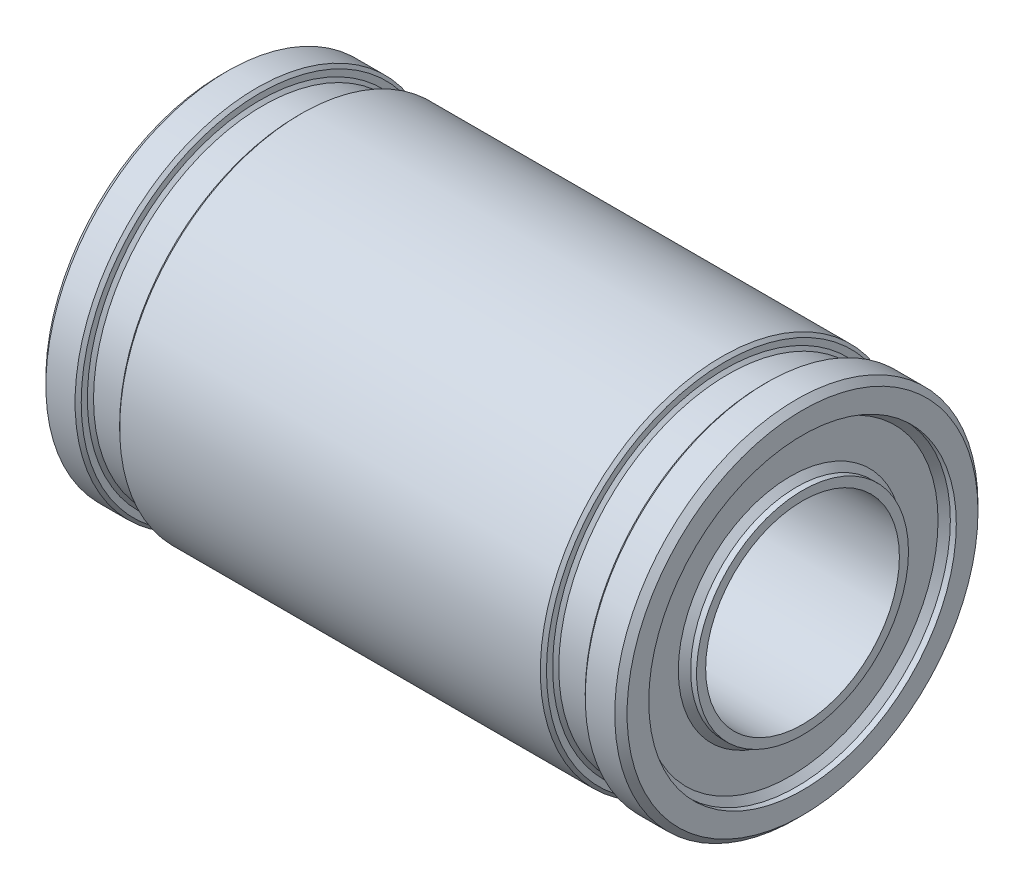
ISO-10303-21;
HEADER;
FILE_DESCRIPTION(('STEP AP214'),'2;1');
FILE_NAME('part.step','',(''),(''),'','','');
FILE_SCHEMA(('AUTOMOTIVE_DESIGN { 1 0 10303 214 1 1 1 1 }'));
ENDSEC;
DATA;
#1=APPLICATION_CONTEXT('core data for automotive mechanical design processes');
#2=APPLICATION_PROTOCOL_DEFINITION('international standard','automotive_design',2000,#1);
#3=PRODUCT_CONTEXT('',#1,'mechanical');
#4=PRODUCT('Part','Part','',(#3));
#5=PRODUCT_RELATED_PRODUCT_CATEGORY('part','',(#4));
#6=PRODUCT_DEFINITION_FORMATION('','',#4);
#7=PRODUCT_DEFINITION_CONTEXT('part definition',#1,'design');
#8=PRODUCT_DEFINITION('design','',#6,#7);
#9=PRODUCT_DEFINITION_SHAPE('','',#8);
#10=(LENGTH_UNIT() NAMED_UNIT(*) SI_UNIT(.MILLI.,.METRE.));
#11=(NAMED_UNIT(*) PLANE_ANGLE_UNIT() SI_UNIT($,.RADIAN.));
#12=(NAMED_UNIT(*) SI_UNIT($,.STERADIAN.) SOLID_ANGLE_UNIT());
#13=UNCERTAINTY_MEASURE_WITH_UNIT(LENGTH_MEASURE(1.E-05),#10,'distance_accuracy_value','');
#14=(GEOMETRIC_REPRESENTATION_CONTEXT(3) GLOBAL_UNCERTAINTY_ASSIGNED_CONTEXT((#13)) GLOBAL_UNIT_ASSIGNED_CONTEXT((#10,
#11,#12)) REPRESENTATION_CONTEXT('',''));
#15=CARTESIAN_POINT('',(0.,0.,0.));
#16=DIRECTION('',(0.,0.,1.));
#17=DIRECTION('',(1.,0.,0.));
#18=AXIS2_PLACEMENT_3D('',#15,#16,#17);
#19=CARTESIAN_POINT('',(-1.70147576583624E-09,0.,0.));
#20=DIRECTION('',(1.,0.,0.));
#21=DIRECTION('',(0.,0.,-1.));
#22=AXIS2_PLACEMENT_3D('',#19,#20,#21);
#23=CYLINDRICAL_SURFACE('',#22,6.35);
#24=CARTESIAN_POINT('',(24.,0.,0.));
#25=DIRECTION('',(1.,0.,0.));
#26=DIRECTION('',(0.,0.,-1.));
#27=AXIS2_PLACEMENT_3D('',#24,#25,#26);
#28=CIRCLE('',#27,6.35);
#29=CARTESIAN_POINT('',(24.,0.,-6.35));
#30=VERTEX_POINT('',#29);
#31=EDGE_CURVE('E10',#30,#30,#28,.T.);
#32=ORIENTED_EDGE('',*,*,#31,.T.);
#33=EDGE_LOOP('',(#32));
#34=FACE_BOUND('',#33,.T.);
#35=CARTESIAN_POINT('',(23.754,0.,0.));
#36=DIRECTION('',(1.,0.,0.));
#37=DIRECTION('',(0.,0.,-1.));
#38=AXIS2_PLACEMENT_3D('',#35,#36,#37);
#39=CIRCLE('',#38,6.35);
#40=CARTESIAN_POINT('',(23.754,0.,-6.35));
#41=VERTEX_POINT('',#40);
#42=EDGE_CURVE('E139',#41,#41,#39,.T.);
#43=ORIENTED_EDGE('',*,*,#42,.F.);
#44=EDGE_LOOP('',(#43));
#45=FACE_BOUND('',#44,.T.);
#46=ADVANCED_FACE('F33',(#34,#45),#23,.F.);
#47=CARTESIAN_POINT('',(24.,6.35,0.));
#48=DIRECTION('',(1.,0.,0.));
#49=DIRECTION('',(0.,0.,-1.));
#50=AXIS2_PLACEMENT_3D('',#47,#48,#49);
#51=PLANE('',#50);
#52=CARTESIAN_POINT('',(24.,0.,0.));
#53=DIRECTION('',(1.,0.,0.));
#54=DIRECTION('',(0.,0.,-1.));
#55=AXIS2_PLACEMENT_3D('',#52,#53,#54);
#56=CIRCLE('',#55,7.24599999914927);
#57=CARTESIAN_POINT('',(24.,0.,-7.24599999914927));
#58=VERTEX_POINT('',#57);
#59=EDGE_CURVE('E39',#58,#58,#56,.T.);
#60=ORIENTED_EDGE('',*,*,#59,.T.);
#61=EDGE_LOOP('',(#60));
#62=FACE_BOUND('',#61,.T.);
#63=ORIENTED_EDGE('',*,*,#31,.F.);
#64=EDGE_LOOP('',(#63));
#65=FACE_BOUND('',#64,.T.);
#66=ADVANCED_FACE('F147',(#62,#65),#51,.T.);
#67=CARTESIAN_POINT('',(24.,0.,0.));
#68=DIRECTION('',(-1.,0.,0.));
#69=DIRECTION('',(0.,0.,1.));
#70=AXIS2_PLACEMENT_3D('',#67,#68,#69);
#71=CONICAL_SURFACE('',#70,7.24599999914927,0.785398163397448);
#72=CARTESIAN_POINT('',(23.746,0.,0.));
#73=DIRECTION('',(1.,0.,0.));
#74=DIRECTION('',(0.,0.,-1.));
#75=AXIS2_PLACEMENT_3D('',#72,#73,#74);
#76=CIRCLE('',#75,7.49999999914926);
#77=CARTESIAN_POINT('',(23.746,0.,-7.49999999914926));
#78=VERTEX_POINT('',#77);
#79=EDGE_CURVE('E43',#78,#78,#76,.T.);
#80=ORIENTED_EDGE('',*,*,#79,.T.);
#81=EDGE_LOOP('',(#80));
#82=FACE_BOUND('',#81,.T.);
#83=ORIENTED_EDGE('',*,*,#59,.F.);
#84=EDGE_LOOP('',(#83));
#85=FACE_BOUND('',#84,.T.);
#86=ADVANCED_FACE('F151',(#82,#85),#71,.T.);
#87=CARTESIAN_POINT('',(-1.70147576583624E-09,0.,0.));
#88=DIRECTION('',(1.,0.,0.));
#89=DIRECTION('',(0.,0.,-1.));
#90=AXIS2_PLACEMENT_3D('',#87,#88,#89);
#91=CYLINDRICAL_SURFACE('',#90,7.49999999914926);
#92=CARTESIAN_POINT('',(22.5268000008508,0.,0.));
#93=DIRECTION('',(1.,0.,0.));
#94=DIRECTION('',(0.,0.,-1.));
#95=AXIS2_PLACEMENT_3D('',#92,#93,#94);
#96=CIRCLE('',#95,7.49999999914926);
#97=CARTESIAN_POINT('',(22.5268000008508,0.,-7.49999999914926));
#98=VERTEX_POINT('',#97);
#99=EDGE_CURVE('E47',#98,#98,#96,.T.);
#100=ORIENTED_EDGE('',*,*,#99,.T.);
#101=EDGE_LOOP('',(#100));
#102=FACE_BOUND('',#101,.T.);
#103=ORIENTED_EDGE('',*,*,#79,.F.);
#104=EDGE_LOOP('',(#103));
#105=FACE_BOUND('',#104,.T.);
#106=ADVANCED_FACE('F155',(#102,#105),#91,.T.);
#107=CARTESIAN_POINT('',(22.5268000008508,0.,0.));
#108=DIRECTION('',(1.,0.,0.));
#109=DIRECTION('',(0.,0.,-1.));
#110=AXIS2_PLACEMENT_3D('',#107,#108,#109);
#111=CONICAL_SURFACE('',#110,7.49999999914926,0.785398153349373);
#112=CARTESIAN_POINT('',(22.3998000017015,0.,0.));
#113=DIRECTION('',(1.,0.,0.));
#114=DIRECTION('',(0.,0.,-1.));
#115=AXIS2_PLACEMENT_3D('',#112,#113,#114);
#116=CIRCLE('',#115,7.37300000255221);
#117=CARTESIAN_POINT('',(22.3998000017015,0.,-7.37300000255221));
#118=VERTEX_POINT('',#117);
#119=EDGE_CURVE('E52',#118,#118,#116,.T.);
#120=ORIENTED_EDGE('',*,*,#119,.T.);
#121=EDGE_LOOP('',(#120));
#122=FACE_BOUND('',#121,.T.);
#123=ORIENTED_EDGE('',*,*,#99,.F.);
#124=EDGE_LOOP('',(#123));
#125=FACE_BOUND('',#124,.T.);
#126=ADVANCED_FACE('F162',(#122,#125),#111,.T.);
#127=CARTESIAN_POINT('',(22.3998000017015,7.37300000255221,0.));
#128=DIRECTION('',(-1.,0.,0.));
#129=DIRECTION('',(0.,0.,1.));
#130=AXIS2_PLACEMENT_3D('',#127,#128,#129);
#131=PLANE('',#130);
#132=CARTESIAN_POINT('',(22.3998000017015,0.,0.));
#133=DIRECTION('',(1.,0.,0.));
#134=DIRECTION('',(0.,0.,-1.));
#135=AXIS2_PLACEMENT_3D('',#132,#133,#134);
#136=CIRCLE('',#135,7.11900000085074);
#137=CARTESIAN_POINT('',(22.3998000017015,0.,-7.11900000085074));
#138=VERTEX_POINT('',#137);
#139=EDGE_CURVE('E55',#138,#138,#136,.T.);
#140=ORIENTED_EDGE('',*,*,#139,.T.);
#141=EDGE_LOOP('',(#140));
#142=FACE_BOUND('',#141,.T.);
#143=ORIENTED_EDGE('',*,*,#119,.F.);
#144=EDGE_LOOP('',(#143));
#145=FACE_BOUND('',#144,.T.);
#146=ADVANCED_FACE('F166',(#142,#145),#131,.T.);
#147=CARTESIAN_POINT('',(22.3998000017015,0.,0.));
#148=DIRECTION('',(1.,0.,0.));
#149=DIRECTION('',(0.,0.,-1.));
#150=AXIS2_PLACEMENT_3D('',#147,#148,#149);
#151=CONICAL_SURFACE('',#150,7.11900000085074,0.785398163397445);
#152=CARTESIAN_POINT('',(22.2728000017015,0.,0.));
#153=DIRECTION('',(1.,0.,0.));
#154=DIRECTION('',(0.,0.,-1.));
#155=AXIS2_PLACEMENT_3D('',#152,#153,#154);
#156=CIRCLE('',#155,6.99200000085074);
#157=CARTESIAN_POINT('',(22.2728000017015,0.,-6.99200000085074));
#158=VERTEX_POINT('',#157);
#159=EDGE_CURVE('E58',#158,#158,#156,.T.);
#160=ORIENTED_EDGE('',*,*,#159,.T.);
#161=EDGE_LOOP('',(#160));
#162=FACE_BOUND('',#161,.T.);
#163=ORIENTED_EDGE('',*,*,#139,.F.);
#164=EDGE_LOOP('',(#163));
#165=FACE_BOUND('',#164,.T.);
#166=ADVANCED_FACE('F170',(#162,#165),#151,.T.);
#167=CARTESIAN_POINT('',(-1.70147576583624E-09,0.,0.));
#168=DIRECTION('',(1.,0.,0.));
#169=DIRECTION('',(0.,0.,-1.));
#170=AXIS2_PLACEMENT_3D('',#167,#168,#169);
#171=CYLINDRICAL_SURFACE('',#170,6.99200000085074);
#172=CARTESIAN_POINT('',(20.9266000025522,0.,0.));
#173=DIRECTION('',(1.,0.,0.));
#174=DIRECTION('',(0.,0.,-1.));
#175=AXIS2_PLACEMENT_3D('',#172,#173,#174);
#176=CIRCLE('',#175,6.99200000085074);
#177=CARTESIAN_POINT('',(20.9266000025522,0.,-6.99200000085074));
#178=VERTEX_POINT('',#177);
#179=EDGE_CURVE('E61',#178,#178,#176,.T.);
#180=ORIENTED_EDGE('',*,*,#179,.T.);
#181=EDGE_LOOP('',(#180));
#182=FACE_BOUND('',#181,.T.);
#183=ORIENTED_EDGE('',*,*,#159,.F.);
#184=EDGE_LOOP('',(#183));
#185=FACE_BOUND('',#184,.T.);
#186=ADVANCED_FACE('F174',(#182,#185),#171,.T.);
#187=CARTESIAN_POINT('',(20.9266000025522,0.,0.));
#188=DIRECTION('',(-1.,0.,0.));
#189=DIRECTION('',(0.,0.,1.));
#190=AXIS2_PLACEMENT_3D('',#187,#188,#189);
#191=CONICAL_SURFACE('',#190,6.99200000085074,0.785398139951919);
#192=CARTESIAN_POINT('',(20.7996,0.,0.));
#193=DIRECTION('',(1.,0.,0.));
#194=DIRECTION('',(0.,0.,-1.));
#195=AXIS2_PLACEMENT_3D('',#192,#193,#194);
#196=CIRCLE('',#195,7.11899999744779);
#197=CARTESIAN_POINT('',(20.7996,0.,-7.11899999744779));
#198=VERTEX_POINT('',#197);
#199=EDGE_CURVE('E64',#198,#198,#196,.T.);
#200=ORIENTED_EDGE('',*,*,#199,.T.);
#201=EDGE_LOOP('',(#200));
#202=FACE_BOUND('',#201,.T.);
#203=ORIENTED_EDGE('',*,*,#179,.F.);
#204=EDGE_LOOP('',(#203));
#205=FACE_BOUND('',#204,.T.);
#206=ADVANCED_FACE('F178',(#202,#205),#191,.T.);
#207=CARTESIAN_POINT('',(20.7996,7.11899999744779,0.));
#208=DIRECTION('',(1.,0.,0.));
#209=DIRECTION('',(0.,0.,-1.));
#210=AXIS2_PLACEMENT_3D('',#207,#208,#209);
#211=PLANE('',#210);
#212=CARTESIAN_POINT('',(20.7996,0.,0.));
#213=DIRECTION('',(1.,0.,0.));
#214=DIRECTION('',(0.,0.,-1.));
#215=AXIS2_PLACEMENT_3D('',#212,#213,#214);
#216=CIRCLE('',#215,7.37299999914926);
#217=CARTESIAN_POINT('',(20.7996,0.,-7.37299999914926));
#218=VERTEX_POINT('',#217);
#219=EDGE_CURVE('E67',#218,#218,#216,.T.);
#220=ORIENTED_EDGE('',*,*,#219,.T.);
#221=EDGE_LOOP('',(#220));
#222=FACE_BOUND('',#221,.T.);
#223=ORIENTED_EDGE('',*,*,#199,.F.);
#224=EDGE_LOOP('',(#223));
#225=FACE_BOUND('',#224,.T.);
#226=ADVANCED_FACE('F182',(#222,#225),#211,.T.);
#227=CARTESIAN_POINT('',(20.7996,0.,0.));
#228=DIRECTION('',(-1.,0.,0.));
#229=DIRECTION('',(0.,0.,1.));
#230=AXIS2_PLACEMENT_3D('',#227,#228,#229);
#231=CONICAL_SURFACE('',#230,7.37299999914926,0.785398163397445);
#232=CARTESIAN_POINT('',(20.6726,0.,0.));
#233=DIRECTION('',(1.,0.,0.));
#234=DIRECTION('',(0.,0.,-1.));
#235=AXIS2_PLACEMENT_3D('',#232,#233,#234);
#236=CIRCLE('',#235,7.49999999914926);
#237=CARTESIAN_POINT('',(20.6726,0.,-7.49999999914926));
#238=VERTEX_POINT('',#237);
#239=EDGE_CURVE('E70',#238,#238,#236,.T.);
#240=ORIENTED_EDGE('',*,*,#239,.T.);
#241=EDGE_LOOP('',(#240));
#242=FACE_BOUND('',#241,.T.);
#243=ORIENTED_EDGE('',*,*,#219,.F.);
#244=EDGE_LOOP('',(#243));
#245=FACE_BOUND('',#244,.T.);
#246=ADVANCED_FACE('F186',(#242,#245),#231,.T.);
#247=CARTESIAN_POINT('',(-1.70147576583624E-09,0.,0.));
#248=DIRECTION('',(1.,0.,0.));
#249=DIRECTION('',(0.,0.,-1.));
#250=AXIS2_PLACEMENT_3D('',#247,#248,#249);
#251=CYLINDRICAL_SURFACE('',#250,7.49999999914926);
#252=CARTESIAN_POINT('',(3.30200000085074,0.,0.));
#253=DIRECTION('',(1.,0.,0.));
#254=DIRECTION('',(0.,0.,-1.));
#255=AXIS2_PLACEMENT_3D('',#252,#253,#254);
#256=CIRCLE('',#255,7.49999999914926);
#257=CARTESIAN_POINT('',(3.30200000085074,0.,-7.49999999914926));
#258=VERTEX_POINT('',#257);
#259=EDGE_CURVE('E73',#258,#258,#256,.T.);
#260=ORIENTED_EDGE('',*,*,#259,.T.);
#261=EDGE_LOOP('',(#260));
#262=FACE_BOUND('',#261,.T.);
#263=ORIENTED_EDGE('',*,*,#239,.F.);
#264=EDGE_LOOP('',(#263));
#265=FACE_BOUND('',#264,.T.);
#266=ADVANCED_FACE('F190',(#262,#265),#251,.T.);
#267=CARTESIAN_POINT('',(3.30200000085074,0.,0.));
#268=DIRECTION('',(1.,0.,0.));
#269=DIRECTION('',(0.,0.,-1.));
#270=AXIS2_PLACEMENT_3D('',#267,#268,#269);
#271=CONICAL_SURFACE('',#270,7.49999999914926,0.785398153349359);
#272=CARTESIAN_POINT('',(3.17500000170148,0.,0.));
#273=DIRECTION('',(1.,0.,0.));
#274=DIRECTION('',(0.,0.,-1.));
#275=AXIS2_PLACEMENT_3D('',#272,#273,#274);
#276=CIRCLE('',#275,7.37300000255221);
#277=CARTESIAN_POINT('',(3.17500000170148,0.,-7.37300000255221));
#278=VERTEX_POINT('',#277);
#279=EDGE_CURVE('E76',#278,#278,#276,.T.);
#280=ORIENTED_EDGE('',*,*,#279,.T.);
#281=EDGE_LOOP('',(#280));
#282=FACE_BOUND('',#281,.T.);
#283=ORIENTED_EDGE('',*,*,#259,.F.);
#284=EDGE_LOOP('',(#283));
#285=FACE_BOUND('',#284,.T.);
#286=ADVANCED_FACE('F194',(#282,#285),#271,.T.);
#287=CARTESIAN_POINT('',(3.17500000170148,7.37300000255221,0.));
#288=DIRECTION('',(-1.,0.,0.));
#289=DIRECTION('',(0.,0.,1.));
#290=AXIS2_PLACEMENT_3D('',#287,#288,#289);
#291=PLANE('',#290);
#292=CARTESIAN_POINT('',(3.17500000170148,0.,0.));
#293=DIRECTION('',(1.,0.,0.));
#294=DIRECTION('',(0.,0.,-1.));
#295=AXIS2_PLACEMENT_3D('',#292,#293,#294);
#296=CIRCLE('',#295,7.11900000085074);
#297=CARTESIAN_POINT('',(3.17500000170148,0.,-7.11900000085074));
#298=VERTEX_POINT('',#297);
#299=EDGE_CURVE('E79',#298,#298,#296,.T.);
#300=ORIENTED_EDGE('',*,*,#299,.T.);
#301=EDGE_LOOP('',(#300));
#302=FACE_BOUND('',#301,.T.);
#303=ORIENTED_EDGE('',*,*,#279,.F.);
#304=EDGE_LOOP('',(#303));
#305=FACE_BOUND('',#304,.T.);
#306=ADVANCED_FACE('F198',(#302,#305),#291,.T.);
#307=CARTESIAN_POINT('',(3.17500000170148,0.,0.));
#308=DIRECTION('',(1.,0.,0.));
#309=DIRECTION('',(0.,0.,-1.));
#310=AXIS2_PLACEMENT_3D('',#307,#308,#309);
#311=CONICAL_SURFACE('',#310,7.11900000085074,0.785398163397448);
#312=CARTESIAN_POINT('',(3.04800000170148,0.,0.));
#313=DIRECTION('',(1.,0.,0.));
#314=DIRECTION('',(0.,0.,-1.));
#315=AXIS2_PLACEMENT_3D('',#312,#313,#314);
#316=CIRCLE('',#315,6.99200000085073);
#317=CARTESIAN_POINT('',(3.04800000170148,0.,-6.99200000085073));
#318=VERTEX_POINT('',#317);
#319=EDGE_CURVE('E82',#318,#318,#316,.T.);
#320=ORIENTED_EDGE('',*,*,#319,.T.);
#321=EDGE_LOOP('',(#320));
#322=FACE_BOUND('',#321,.T.);
#323=ORIENTED_EDGE('',*,*,#299,.F.);
#324=EDGE_LOOP('',(#323));
#325=FACE_BOUND('',#324,.T.);
#326=ADVANCED_FACE('F202',(#322,#325),#311,.T.);
#327=CARTESIAN_POINT('',(-1.70147576583624E-09,0.,0.));
#328=DIRECTION('',(1.,0.,0.));
#329=DIRECTION('',(0.,0.,-1.));
#330=AXIS2_PLACEMENT_3D('',#327,#328,#329);
#331=CYLINDRICAL_SURFACE('',#330,6.99200000085073);
#332=CARTESIAN_POINT('',(1.71450000255221,0.,0.));
#333=DIRECTION('',(1.,0.,0.));
#334=DIRECTION('',(0.,0.,-1.));
#335=AXIS2_PLACEMENT_3D('',#332,#333,#334);
#336=CIRCLE('',#335,6.99200000085073);
#337=CARTESIAN_POINT('',(1.71450000255221,0.,-6.99200000085073));
#338=VERTEX_POINT('',#337);
#339=EDGE_CURVE('E85',#338,#338,#336,.T.);
#340=ORIENTED_EDGE('',*,*,#339,.T.);
#341=EDGE_LOOP('',(#340));
#342=FACE_BOUND('',#341,.T.);
#343=ORIENTED_EDGE('',*,*,#319,.F.);
#344=EDGE_LOOP('',(#343));
#345=FACE_BOUND('',#344,.T.);
#346=ADVANCED_FACE('F206',(#342,#345),#331,.T.);
#347=CARTESIAN_POINT('',(1.71450000255221,0.,0.));
#348=DIRECTION('',(-1.,0.,0.));
#349=DIRECTION('',(0.,0.,1.));
#350=AXIS2_PLACEMENT_3D('',#347,#348,#349);
#351=CONICAL_SURFACE('',#350,6.99200000085073,0.785398150000001);
#352=CARTESIAN_POINT('',(1.58750000085074,0.,0.));
#353=DIRECTION('',(1.,0.,0.));
#354=DIRECTION('',(0.,0.,-1.));
#355=AXIS2_PLACEMENT_3D('',#352,#353,#354);
#356=CIRCLE('',#355,7.11899999914926);
#357=CARTESIAN_POINT('',(1.58750000085074,0.,-7.11899999914926));
#358=VERTEX_POINT('',#357);
#359=EDGE_CURVE('E88',#358,#358,#356,.T.);
#360=ORIENTED_EDGE('',*,*,#359,.T.);
#361=EDGE_LOOP('',(#360));
#362=FACE_BOUND('',#361,.T.);
#363=ORIENTED_EDGE('',*,*,#339,.F.);
#364=EDGE_LOOP('',(#363));
#365=FACE_BOUND('',#364,.T.);
#366=ADVANCED_FACE('F210',(#362,#365),#351,.T.);
#367=CARTESIAN_POINT('',(1.58750000085074,7.11899999914926,0.));
#368=DIRECTION('',(1.,0.,0.));
#369=DIRECTION('',(0.,0.,-1.));
#370=AXIS2_PLACEMENT_3D('',#367,#368,#369);
#371=PLANE('',#370);
#372=CARTESIAN_POINT('',(1.58750000085074,0.,0.));
#373=DIRECTION('',(1.,0.,0.));
#374=DIRECTION('',(0.,0.,-1.));
#375=AXIS2_PLACEMENT_3D('',#372,#373,#374);
#376=CIRCLE('',#375,7.37300000085073);
#377=CARTESIAN_POINT('',(1.58750000085074,0.,-7.37300000085073));
#378=VERTEX_POINT('',#377);
#379=EDGE_CURVE('E91',#378,#378,#376,.T.);
#380=ORIENTED_EDGE('',*,*,#379,.T.);
#381=EDGE_LOOP('',(#380));
#382=FACE_BOUND('',#381,.T.);
#383=ORIENTED_EDGE('',*,*,#359,.F.);
#384=EDGE_LOOP('',(#383));
#385=FACE_BOUND('',#384,.T.);
#386=ADVANCED_FACE('F214',(#382,#385),#371,.T.);
#387=CARTESIAN_POINT('',(1.58750000085074,0.,0.));
#388=DIRECTION('',(-1.,0.,0.));
#389=DIRECTION('',(0.,0.,1.));
#390=AXIS2_PLACEMENT_3D('',#387,#388,#389);
#391=CONICAL_SURFACE('',#390,7.37300000085073,0.785398150000005);
#392=CARTESIAN_POINT('',(1.46049999914926,0.,0.));
#393=DIRECTION('',(1.,0.,0.));
#394=DIRECTION('',(0.,0.,-1.));
#395=AXIS2_PLACEMENT_3D('',#392,#393,#394);
#396=CIRCLE('',#395,7.49999999914926);
#397=CARTESIAN_POINT('',(1.46049999914926,0.,-7.49999999914926));
#398=VERTEX_POINT('',#397);
#399=EDGE_CURVE('E94',#398,#398,#396,.T.);
#400=ORIENTED_EDGE('',*,*,#399,.T.);
#401=EDGE_LOOP('',(#400));
#402=FACE_BOUND('',#401,.T.);
#403=ORIENTED_EDGE('',*,*,#379,.F.);
#404=EDGE_LOOP('',(#403));
#405=FACE_BOUND('',#404,.T.);
#406=ADVANCED_FACE('F218',(#402,#405),#391,.T.);
#407=CARTESIAN_POINT('',(-1.70147576583624E-09,0.,0.));
#408=DIRECTION('',(1.,0.,0.));
#409=DIRECTION('',(0.,0.,-1.));
#410=AXIS2_PLACEMENT_3D('',#407,#408,#409);
#411=CYLINDRICAL_SURFACE('',#410,7.49999999914926);
#412=CARTESIAN_POINT('',(0.254000000000001,0.,0.));
#413=DIRECTION('',(1.,0.,0.));
#414=DIRECTION('',(0.,0.,-1.));
#415=AXIS2_PLACEMENT_3D('',#412,#413,#414);
#416=CIRCLE('',#415,7.49999999914926);
#417=CARTESIAN_POINT('',(0.254000000000001,0.,-7.49999999914926));
#418=VERTEX_POINT('',#417);
#419=EDGE_CURVE('E97',#418,#418,#416,.T.);
#420=ORIENTED_EDGE('',*,*,#419,.T.);
#421=EDGE_LOOP('',(#420));
#422=FACE_BOUND('',#421,.T.);
#423=ORIENTED_EDGE('',*,*,#399,.F.);
#424=EDGE_LOOP('',(#423));
#425=FACE_BOUND('',#424,.T.);
#426=ADVANCED_FACE('F222',(#422,#425),#411,.T.);
#427=CARTESIAN_POINT('',(0.254000000000001,0.,0.));
#428=DIRECTION('',(1.,0.,0.));
#429=DIRECTION('',(0.,0.,-1.));
#430=AXIS2_PLACEMENT_3D('',#427,#428,#429);
#431=CONICAL_SURFACE('',#430,7.49999999914926,0.785398163397448);
#432=CARTESIAN_POINT('',(0.,0.,0.));
#433=DIRECTION('',(1.,0.,0.));
#434=DIRECTION('',(0.,0.,-1.));
#435=AXIS2_PLACEMENT_3D('',#432,#433,#434);
#436=CIRCLE('',#435,7.24599999914926);
#437=CARTESIAN_POINT('',(0.,0.,-7.24599999914926));
#438=VERTEX_POINT('',#437);
#439=EDGE_CURVE('E100',#438,#438,#436,.T.);
#440=ORIENTED_EDGE('',*,*,#439,.T.);
#441=EDGE_LOOP('',(#440));
#442=FACE_BOUND('',#441,.T.);
#443=ORIENTED_EDGE('',*,*,#419,.F.);
#444=EDGE_LOOP('',(#443));
#445=FACE_BOUND('',#444,.T.);
#446=ADVANCED_FACE('F226',(#442,#445),#431,.T.);
#447=CARTESIAN_POINT('',(0.,7.24599999914926,0.));
#448=DIRECTION('',(-1.,0.,0.));
#449=DIRECTION('',(0.,0.,1.));
#450=AXIS2_PLACEMENT_3D('',#447,#448,#449);
#451=PLANE('',#450);
#452=CARTESIAN_POINT('',(0.,0.,0.));
#453=DIRECTION('',(1.,0.,0.));
#454=DIRECTION('',(0.,0.,-1.));
#455=AXIS2_PLACEMENT_3D('',#452,#453,#454);
#456=CIRCLE('',#455,6.35);
#457=CARTESIAN_POINT('',(0.,0.,-6.35));
#458=VERTEX_POINT('',#457);
#459=EDGE_CURVE('E103',#458,#458,#456,.T.);
#460=ORIENTED_EDGE('',*,*,#459,.T.);
#461=EDGE_LOOP('',(#460));
#462=FACE_BOUND('',#461,.T.);
#463=ORIENTED_EDGE('',*,*,#439,.F.);
#464=EDGE_LOOP('',(#463));
#465=FACE_BOUND('',#464,.T.);
#466=ADVANCED_FACE('F230',(#462,#465),#451,.T.);
#467=CARTESIAN_POINT('',(-1.70147576583624E-09,0.,0.));
#468=DIRECTION('',(1.,0.,0.));
#469=DIRECTION('',(0.,0.,-1.));
#470=AXIS2_PLACEMENT_3D('',#467,#468,#469);
#471=CYLINDRICAL_SURFACE('',#470,6.35);
#472=CARTESIAN_POINT('',(0.256329420676478,0.,0.));
#473=DIRECTION('',(1.,0.,0.));
#474=DIRECTION('',(0.,0.,-1.));
#475=AXIS2_PLACEMENT_3D('',#472,#473,#474);
#476=CIRCLE('',#475,6.35);
#477=CARTESIAN_POINT('',(0.256329420676478,0.,-6.35));
#478=VERTEX_POINT('',#477);
#479=EDGE_CURVE('E106',#478,#478,#476,.T.);
#480=ORIENTED_EDGE('',*,*,#479,.T.);
#481=EDGE_LOOP('',(#480));
#482=FACE_BOUND('',#481,.T.);
#483=ORIENTED_EDGE('',*,*,#459,.F.);
#484=EDGE_LOOP('',(#483));
#485=FACE_BOUND('',#484,.T.);
#486=ADVANCED_FACE('F234',(#482,#485),#471,.F.);
#487=CARTESIAN_POINT('',(0.256329420676478,0.,0.));
#488=DIRECTION('',(-1.,0.,0.));
#489=DIRECTION('',(0.,0.,1.));
#490=AXIS2_PLACEMENT_3D('',#487,#488,#489);
#491=CONICAL_SURFACE('',#490,6.35,0.785398163397448);
#492=CARTESIAN_POINT('',(0.510329420676478,0.,0.));
#493=DIRECTION('',(1.,0.,0.));
#494=DIRECTION('',(0.,0.,-1.));
#495=AXIS2_PLACEMENT_3D('',#492,#493,#494);
#496=CIRCLE('',#495,6.096);
#497=CARTESIAN_POINT('',(0.510329420676478,0.,-6.096));
#498=VERTEX_POINT('',#497);
#499=EDGE_CURVE('E109',#498,#498,#496,.T.);
#500=ORIENTED_EDGE('',*,*,#499,.T.);
#501=EDGE_LOOP('',(#500));
#502=FACE_BOUND('',#501,.T.);
#503=ORIENTED_EDGE('',*,*,#479,.F.);
#504=EDGE_LOOP('',(#503));
#505=FACE_BOUND('',#504,.T.);
#506=ADVANCED_FACE('F238',(#502,#505),#491,.F.);
#507=CARTESIAN_POINT('',(0.510329420676478,6.096,0.));
#508=DIRECTION('',(-1.,0.,0.));
#509=DIRECTION('',(0.,0.,1.));
#510=AXIS2_PLACEMENT_3D('',#507,#508,#509);
#511=PLANE('',#510);
#512=CARTESIAN_POINT('',(0.510329420676478,0.,0.));
#513=DIRECTION('',(1.,0.,0.));
#514=DIRECTION('',(0.,0.,-1.));
#515=AXIS2_PLACEMENT_3D('',#512,#513,#514);
#516=CIRCLE('',#515,4.62949932692042);
#517=CARTESIAN_POINT('',(0.510329420676478,0.,-4.62949932692042));
#518=VERTEX_POINT('',#517);
#519=EDGE_CURVE('E112',#518,#518,#516,.T.);
#520=ORIENTED_EDGE('',*,*,#519,.T.);
#521=EDGE_LOOP('',(#520));
#522=FACE_BOUND('',#521,.T.);
#523=ORIENTED_EDGE('',*,*,#499,.F.);
#524=EDGE_LOOP('',(#523));
#525=FACE_BOUND('',#524,.T.);
#526=ADVANCED_FACE('F242',(#522,#525),#511,.T.);
#527=CARTESIAN_POINT('',(0.510329420676478,0.,0.));
#528=DIRECTION('',(1.,0.,0.));
#529=DIRECTION('',(0.,0.,-1.));
#530=AXIS2_PLACEMENT_3D('',#527,#528,#529);
#531=CONICAL_SURFACE('',#530,4.62949932692042,0.78539815);
#532=CARTESIAN_POINT('',(0.256329417273526,0.,0.));
#533=DIRECTION('',(1.,0.,0.));
#534=DIRECTION('',(0.,0.,-1.));
#535=AXIS2_PLACEMENT_3D('',#532,#533,#534);
#536=CIRCLE('',#535,4.37549933032337);
#537=CARTESIAN_POINT('',(0.256329417273526,0.,-4.37549933032337));
#538=VERTEX_POINT('',#537);
#539=EDGE_CURVE('E115',#538,#538,#536,.T.);
#540=ORIENTED_EDGE('',*,*,#539,.T.);
#541=EDGE_LOOP('',(#540));
#542=FACE_BOUND('',#541,.T.);
#543=ORIENTED_EDGE('',*,*,#519,.F.);
#544=EDGE_LOOP('',(#543));
#545=FACE_BOUND('',#544,.T.);
#546=ADVANCED_FACE('F246',(#542,#545),#531,.T.);
#547=CARTESIAN_POINT('',(-1.70147576583624E-09,0.,0.));
#548=DIRECTION('',(1.,0.,0.));
#549=DIRECTION('',(0.,0.,-1.));
#550=AXIS2_PLACEMENT_3D('',#547,#548,#549);
#551=CYLINDRICAL_SURFACE('',#550,4.37549933032337);
#552=CARTESIAN_POINT('',(0.,0.,0.));
#553=DIRECTION('',(1.,0.,0.));
#554=DIRECTION('',(0.,0.,-1.));
#555=AXIS2_PLACEMENT_3D('',#552,#553,#554);
#556=CIRCLE('',#555,4.37549933032337);
#557=CARTESIAN_POINT('',(0.,0.,-4.37549933032337));
#558=VERTEX_POINT('',#557);
#559=EDGE_CURVE('E118',#558,#558,#556,.T.);
#560=ORIENTED_EDGE('',*,*,#559,.T.);
#561=EDGE_LOOP('',(#560));
#562=FACE_BOUND('',#561,.T.);
#563=ORIENTED_EDGE('',*,*,#539,.F.);
#564=EDGE_LOOP('',(#563));
#565=FACE_BOUND('',#564,.T.);
#566=ADVANCED_FACE('F250',(#562,#565),#551,.T.);
#567=CARTESIAN_POINT('',(0.,4.37549933032337,0.));
#568=DIRECTION('',(-1.,0.,0.));
#569=DIRECTION('',(0.,0.,1.));
#570=AXIS2_PLACEMENT_3D('',#567,#568,#569);
#571=PLANE('',#570);
#572=CARTESIAN_POINT('',(0.,0.,0.));
#573=DIRECTION('',(1.,0.,0.));
#574=DIRECTION('',(0.,0.,-1.));
#575=AXIS2_PLACEMENT_3D('',#572,#573,#574);
#576=CIRCLE('',#575,3.99999999744779);
#577=CARTESIAN_POINT('',(0.,0.,-3.99999999744779));
#578=VERTEX_POINT('',#577);
#579=EDGE_CURVE('E121',#578,#578,#576,.T.);
#580=ORIENTED_EDGE('',*,*,#579,.T.);
#581=EDGE_LOOP('',(#580));
#582=FACE_BOUND('',#581,.T.);
#583=ORIENTED_EDGE('',*,*,#559,.F.);
#584=EDGE_LOOP('',(#583));
#585=FACE_BOUND('',#584,.T.);
#586=ADVANCED_FACE('F254',(#582,#585),#571,.T.);
#587=CARTESIAN_POINT('',(-1.70147576583624E-09,0.,0.));
#588=DIRECTION('',(1.,0.,0.));
#589=DIRECTION('',(0.,0.,-1.));
#590=AXIS2_PLACEMENT_3D('',#587,#588,#589);
#591=CYLINDRICAL_SURFACE('',#590,3.99999999744779);
#592=CARTESIAN_POINT('',(24.,0.,0.));
#593=DIRECTION('',(1.,0.,0.));
#594=DIRECTION('',(0.,0.,-1.));
#595=AXIS2_PLACEMENT_3D('',#592,#593,#594);
#596=CIRCLE('',#595,3.99999999744779);
#597=CARTESIAN_POINT('',(24.,0.,-3.99999999744779));
#598=VERTEX_POINT('',#597);
#599=EDGE_CURVE('E124',#598,#598,#596,.T.);
#600=ORIENTED_EDGE('',*,*,#599,.T.);
#601=EDGE_LOOP('',(#600));
#602=FACE_BOUND('',#601,.T.);
#603=ORIENTED_EDGE('',*,*,#579,.F.);
#604=EDGE_LOOP('',(#603));
#605=FACE_BOUND('',#604,.T.);
#606=ADVANCED_FACE('F258',(#602,#605),#591,.F.);
#607=CARTESIAN_POINT('',(24.,3.99999999744779,0.));
#608=DIRECTION('',(1.,0.,0.));
#609=DIRECTION('',(0.,0.,-1.));
#610=AXIS2_PLACEMENT_3D('',#607,#608,#609);
#611=PLANE('',#610);
#612=CARTESIAN_POINT('',(24.,0.,0.));
#613=DIRECTION('',(1.,0.,0.));
#614=DIRECTION('',(0.,0.,-1.));
#615=AXIS2_PLACEMENT_3D('',#612,#613,#614);
#616=CIRCLE('',#615,4.37549933032337);
#617=CARTESIAN_POINT('',(24.,0.,-4.37549933032337));
#618=VERTEX_POINT('',#617);
#619=EDGE_CURVE('E127',#618,#618,#616,.T.);
#620=ORIENTED_EDGE('',*,*,#619,.T.);
#621=EDGE_LOOP('',(#620));
#622=FACE_BOUND('',#621,.T.);
#623=ORIENTED_EDGE('',*,*,#599,.F.);
#624=EDGE_LOOP('',(#623));
#625=FACE_BOUND('',#624,.T.);
#626=ADVANCED_FACE('F262',(#622,#625),#611,.T.);
#627=CARTESIAN_POINT('',(-1.70147576583624E-09,0.,0.));
#628=DIRECTION('',(1.,0.,0.));
#629=DIRECTION('',(0.,0.,-1.));
#630=AXIS2_PLACEMENT_3D('',#627,#628,#629);
#631=CYLINDRICAL_SURFACE('',#630,4.37549933032337);
#632=CARTESIAN_POINT('',(23.7539999982985,0.,0.));
#633=DIRECTION('',(1.,0.,0.));
#634=DIRECTION('',(0.,0.,-1.));
#635=AXIS2_PLACEMENT_3D('',#632,#633,#634);
#636=CIRCLE('',#635,4.37549933032337);
#637=CARTESIAN_POINT('',(23.7539999982985,0.,-4.37549933032337));
#638=VERTEX_POINT('',#637);
#639=EDGE_CURVE('E130',#638,#638,#636,.T.);
#640=ORIENTED_EDGE('',*,*,#639,.T.);
#641=EDGE_LOOP('',(#640));
#642=FACE_BOUND('',#641,.T.);
#643=ORIENTED_EDGE('',*,*,#619,.F.);
#644=EDGE_LOOP('',(#643));
#645=FACE_BOUND('',#644,.T.);
#646=ADVANCED_FACE('F266',(#642,#645),#631,.T.);
#647=CARTESIAN_POINT('',(23.7539999982985,0.,0.));
#648=DIRECTION('',(-1.,0.,0.));
#649=DIRECTION('',(0.,0.,1.));
#650=AXIS2_PLACEMENT_3D('',#647,#648,#649);
#651=CONICAL_SURFACE('',#650,4.37549933032337,0.785398160048083);
#652=CARTESIAN_POINT('',(23.5,0.,0.));
#653=DIRECTION('',(1.,0.,0.));
#654=DIRECTION('',(0.,0.,-1.));
#655=AXIS2_PLACEMENT_3D('',#652,#653,#654);
#656=CIRCLE('',#655,4.62949932692042);
#657=CARTESIAN_POINT('',(23.5,0.,-4.62949932692042));
#658=VERTEX_POINT('',#657);
#659=EDGE_CURVE('E133',#658,#658,#656,.T.);
#660=ORIENTED_EDGE('',*,*,#659,.T.);
#661=EDGE_LOOP('',(#660));
#662=FACE_BOUND('',#661,.T.);
#663=ORIENTED_EDGE('',*,*,#639,.F.);
#664=EDGE_LOOP('',(#663));
#665=FACE_BOUND('',#664,.T.);
#666=ADVANCED_FACE('F270',(#662,#665),#651,.T.);
#667=CARTESIAN_POINT('',(23.5,4.62949932692042,0.));
#668=DIRECTION('',(1.,0.,0.));
#669=DIRECTION('',(0.,0.,-1.));
#670=AXIS2_PLACEMENT_3D('',#667,#668,#669);
#671=PLANE('',#670);
#672=CARTESIAN_POINT('',(23.5,0.,0.));
#673=DIRECTION('',(1.,0.,0.));
#674=DIRECTION('',(0.,0.,-1.));
#675=AXIS2_PLACEMENT_3D('',#672,#673,#674);
#676=CIRCLE('',#675,6.096);
#677=CARTESIAN_POINT('',(23.5,0.,-6.096));
#678=VERTEX_POINT('',#677);
#679=EDGE_CURVE('E136',#678,#678,#676,.T.);
#680=ORIENTED_EDGE('',*,*,#679,.T.);
#681=EDGE_LOOP('',(#680));
#682=FACE_BOUND('',#681,.T.);
#683=ORIENTED_EDGE('',*,*,#659,.F.);
#684=EDGE_LOOP('',(#683));
#685=FACE_BOUND('',#684,.T.);
#686=ADVANCED_FACE('F274',(#682,#685),#671,.T.);
#687=CARTESIAN_POINT('',(23.5,0.,0.));
#688=DIRECTION('',(1.,0.,0.));
#689=DIRECTION('',(0.,0.,-1.));
#690=AXIS2_PLACEMENT_3D('',#687,#688,#689);
#691=CONICAL_SURFACE('',#690,6.096,0.785398163397457);
#692=ORIENTED_EDGE('',*,*,#42,.T.);
#693=EDGE_LOOP('',(#692));
#694=FACE_BOUND('',#693,.T.);
#695=ORIENTED_EDGE('',*,*,#679,.F.);
#696=EDGE_LOOP('',(#695));
#697=FACE_BOUND('',#696,.T.);
#698=ADVANCED_FACE('F143',(#694,#697),#691,.F.);
#699=CLOSED_SHELL('',(#46,#66,#86,#106,#126,#146,#166,#186,#206,#226,#246,#266,#286,#306,#326,
#346,#366,#386,#406,#426,#446,#466,#486,#506,#526,#546,#566,#586,#606,#626,#646,#666,#686,#698));
#700=MANIFOLD_SOLID_BREP('B2',#699);
#701=ADVANCED_BREP_SHAPE_REPRESENTATION('',(#18,#700),#14);
#702=SHAPE_DEFINITION_REPRESENTATION(#9,#701);
ENDSEC;
END-ISO-10303-21;
